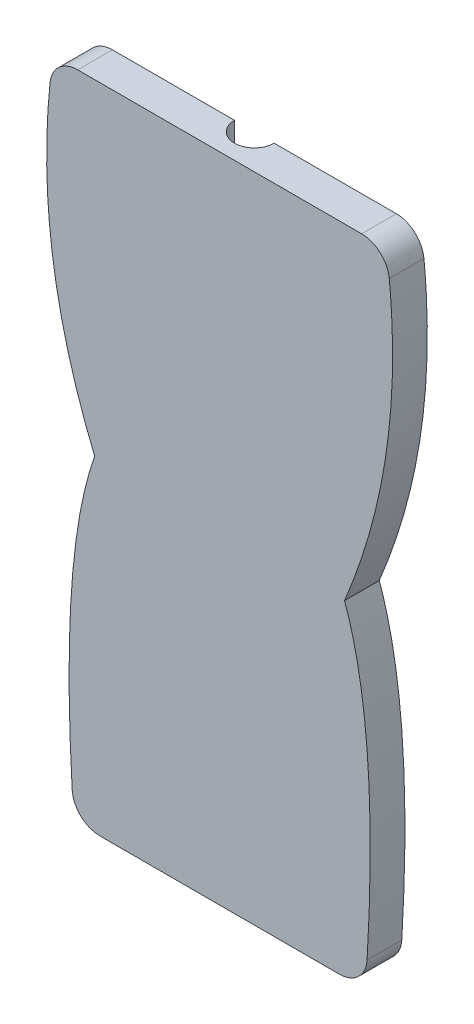
ISO-10303-21;
HEADER;
FILE_DESCRIPTION(('STEP AP214'),'2;1');
FILE_NAME('part.step','',(''),(''),'','','');
FILE_SCHEMA(('AUTOMOTIVE_DESIGN { 1 0 10303 214 1 1 1 1 }'));
ENDSEC;
DATA;
#1=APPLICATION_CONTEXT('core data for automotive mechanical design processes');
#2=APPLICATION_PROTOCOL_DEFINITION('international standard','automotive_design',2000,#1);
#3=PRODUCT_CONTEXT('',#1,'mechanical');
#4=PRODUCT('Part','Part','',(#3));
#5=PRODUCT_RELATED_PRODUCT_CATEGORY('part','',(#4));
#6=PRODUCT_DEFINITION_FORMATION('','',#4);
#7=PRODUCT_DEFINITION_CONTEXT('part definition',#1,'design');
#8=PRODUCT_DEFINITION('design','',#6,#7);
#9=PRODUCT_DEFINITION_SHAPE('','',#8);
#10=(LENGTH_UNIT() NAMED_UNIT(*) SI_UNIT(.MILLI.,.METRE.));
#11=(NAMED_UNIT(*) PLANE_ANGLE_UNIT() SI_UNIT($,.RADIAN.));
#12=(NAMED_UNIT(*) SI_UNIT($,.STERADIAN.) SOLID_ANGLE_UNIT());
#13=UNCERTAINTY_MEASURE_WITH_UNIT(LENGTH_MEASURE(1.E-05),#10,'distance_accuracy_value','');
#14=(GEOMETRIC_REPRESENTATION_CONTEXT(3) GLOBAL_UNCERTAINTY_ASSIGNED_CONTEXT((#13)) GLOBAL_UNIT_ASSIGNED_CONTEXT((#10,
#11,#12)) REPRESENTATION_CONTEXT('',''));
#15=CARTESIAN_POINT('',(0.,0.,0.));
#16=DIRECTION('',(0.,0.,1.));
#17=DIRECTION('',(1.,0.,0.));
#18=AXIS2_PLACEMENT_3D('',#15,#16,#17);
#19=CARTESIAN_POINT('',(86.2649284665313,20.,0.));
#20=DIRECTION('',(0.,0.,1.));
#21=DIRECTION('',(1.,0.,0.));
#22=AXIS2_PLACEMENT_3D('',#19,#20,#21);
#23=PLANE('',#22);
#24=DIRECTION('',(0.,-1.,0.));
#25=VECTOR('',#24,1.);
#26=CARTESIAN_POINT('',(-14.285,470.,0.));
#27=LINE('',#26,#25);
#28=CARTESIAN_POINT('',(-14.285,0.,0.));
#29=VERTEX_POINT('',#28);
#30=CARTESIAN_POINT('',(-14.285,470.,0.));
#31=VERTEX_POINT('',#30);
#32=EDGE_CURVE('E11',#29,#31,#27,.F.);
#33=ORIENTED_EDGE('',*,*,#32,.F.);
#34=DIRECTION('',(1.,0.,0.));
#35=VECTOR('',#34,1.);
#36=CARTESIAN_POINT('',(0.,0.,0.));
#37=LINE('',#36,#35);
#38=CARTESIAN_POINT('',(-86.2649284665312,0.,0.));
#39=VERTEX_POINT('',#38);
#40=EDGE_CURVE('E228',#39,#29,#37,.T.);
#41=ORIENTED_EDGE('',*,*,#40,.F.);
#42=CARTESIAN_POINT('',(-86.2649284665313,20.,0.));
#43=DIRECTION('',(0.,0.,1.));
#44=DIRECTION('',(1.,0.,0.));
#45=AXIS2_PLACEMENT_3D('',#42,#43,#44);
#46=CIRCLE('',#45,20.);
#47=CARTESIAN_POINT('',(-106.229930940437,18.8173435761193,0.));
#48=VERTEX_POINT('',#47);
#49=EDGE_CURVE('E105',#48,#39,#46,.T.);
#50=ORIENTED_EDGE('',*,*,#49,.F.);
#51=CARTESIAN_POINT('',(-90.,235.,0.));
#52=CARTESIAN_POINT('',(-98.3103938862567,211.902473228778,0.));
#53=CARTESIAN_POINT('',(-109.325776262568,152.774503719729,0.));
#54=CARTESIAN_POINT('',(-109.130347846538,67.7807022797824,0.));
#55=CARTESIAN_POINT('',(-106.229930940437,18.8173435761193,0.));
#56=B_SPLINE_CURVE_WITH_KNOTS('',3,(#51,#52,#53,#54,#55),.UNSPECIFIED.,.F.,.F.,(4,1,4),(0.,
0.470365123078241,0.940730246156483),.UNSPECIFIED.);
#57=CARTESIAN_POINT('',(-90.,235.,0.));
#58=VERTEX_POINT('',#57);
#59=EDGE_CURVE('E236',#58,#48,#56,.T.);
#60=ORIENTED_EDGE('',*,*,#59,.F.);
#61=CARTESIAN_POINT('',(-122.198947697111,452.052360091864,0.));
#62=CARTESIAN_POINT('',(-126.057079759915,414.653812214876,0.));
#63=CARTESIAN_POINT('',(-124.548720539871,341.079870989253,0.));
#64=CARTESIAN_POINT('',(-104.591114628509,269.952238820302,0.));
#65=CARTESIAN_POINT('',(-90.,235.,0.));
#66=B_SPLINE_CURVE_WITH_KNOTS('',3,(#61,#62,#63,#64,#65),.UNSPECIFIED.,.F.,.F.,(4,1,4),
(0.073881587658608,0.536940793829304,1.),.UNSPECIFIED.);
#67=CARTESIAN_POINT('',(-122.198947697111,452.052360091864,0.));
#68=VERTEX_POINT('',#67);
#69=EDGE_CURVE('E152',#68,#58,#66,.T.);
#70=ORIENTED_EDGE('',*,*,#69,.F.);
#71=CARTESIAN_POINT('',(-102.304530941314,450.,0.));
#72=DIRECTION('',(0.,0.,1.));
#73=DIRECTION('',(1.,0.,0.));
#74=AXIS2_PLACEMENT_3D('',#71,#72,#73);
#75=CIRCLE('',#74,20.0000000000001);
#76=CARTESIAN_POINT('',(-102.304530941314,470.,0.));
#77=VERTEX_POINT('',#76);
#78=EDGE_CURVE('E241',#77,#68,#75,.T.);
#79=ORIENTED_EDGE('',*,*,#78,.F.);
#80=DIRECTION('',(-1.,0.,0.));
#81=VECTOR('',#80,1.);
#82=CARTESIAN_POINT('',(0.,470.,0.));
#83=LINE('',#82,#81);
#84=EDGE_CURVE('E248',#31,#77,#83,.T.);
#85=ORIENTED_EDGE('',*,*,#84,.F.);
#86=EDGE_LOOP('',(#33,#41,#50,#60,#70,#79,#85));
#87=FACE_BOUND('',#86,.T.);
#88=ADVANCED_FACE('F40',(#87),#23,.F.);
#89=DIRECTION('',(0.,-1.,0.));
#90=VECTOR('',#89,1.);
#91=CARTESIAN_POINT('',(14.285,470.,0.));
#92=LINE('',#91,#90);
#93=CARTESIAN_POINT('',(14.285,470.,0.));
#94=VERTEX_POINT('',#93);
#95=CARTESIAN_POINT('',(14.285,0.,0.));
#96=VERTEX_POINT('',#95);
#97=EDGE_CURVE('E49',#94,#96,#92,.T.);
#98=ORIENTED_EDGE('',*,*,#97,.F.);
#99=CARTESIAN_POINT('',(102.304530941314,470.,0.));
#100=VERTEX_POINT('',#99);
#101=EDGE_CURVE('E244',#100,#94,#83,.T.);
#102=ORIENTED_EDGE('',*,*,#101,.F.);
#103=CARTESIAN_POINT('',(102.304530941314,450.,0.));
#104=DIRECTION('',(0.,0.,1.));
#105=DIRECTION('',(1.,0.,0.));
#106=AXIS2_PLACEMENT_3D('',#103,#104,#105);
#107=CIRCLE('',#106,20.);
#108=CARTESIAN_POINT('',(122.198947697111,452.052360091863,0.));
#109=VERTEX_POINT('',#108);
#110=EDGE_CURVE('E251',#109,#100,#107,.T.);
#111=ORIENTED_EDGE('',*,*,#110,.F.);
#112=CARTESIAN_POINT('',(90.,235.,0.));
#113=CARTESIAN_POINT('',(104.591114628509,269.952238820302,0.));
#114=CARTESIAN_POINT('',(124.548720539871,341.079870989253,0.));
#115=CARTESIAN_POINT('',(126.057079759915,414.653812214877,0.));
#116=CARTESIAN_POINT('',(122.198947697111,452.052360091864,0.));
#117=B_SPLINE_CURVE_WITH_KNOTS('',3,(#112,#113,#114,#115,#116),.UNSPECIFIED.,.F.,.F.,(4,1,4),
(0.0738815876586055,0.536940793829303,1.),.UNSPECIFIED.);
#118=CARTESIAN_POINT('',(90.,235.,0.));
#119=VERTEX_POINT('',#118);
#120=EDGE_CURVE('E254',#119,#109,#117,.T.);
#121=ORIENTED_EDGE('',*,*,#120,.F.);
#122=CARTESIAN_POINT('',(106.229930940437,18.8173435761193,0.));
#123=CARTESIAN_POINT('',(109.130347846538,67.7807022797824,0.));
#124=CARTESIAN_POINT('',(109.325776262568,152.774503719729,0.));
#125=CARTESIAN_POINT('',(98.3103938862567,211.902473228778,0.));
#126=CARTESIAN_POINT('',(90.,235.,0.));
#127=B_SPLINE_CURVE_WITH_KNOTS('',3,(#122,#123,#124,#125,#126),.UNSPECIFIED.,.F.,.F.,(4,1,4),
(0.,0.470365123078241,0.940730246156483),.UNSPECIFIED.);
#128=CARTESIAN_POINT('',(106.229930940437,18.8173435761193,0.));
#129=VERTEX_POINT('',#128);
#130=EDGE_CURVE('E257',#129,#119,#127,.T.);
#131=ORIENTED_EDGE('',*,*,#130,.F.);
#132=CARTESIAN_POINT('',(86.2649284665313,20.,0.));
#133=DIRECTION('',(0.,0.,1.));
#134=DIRECTION('',(1.,0.,0.));
#135=AXIS2_PLACEMENT_3D('',#132,#133,#134);
#136=CIRCLE('',#135,20.);
#137=CARTESIAN_POINT('',(86.2649284665312,0.,0.));
#138=VERTEX_POINT('',#137);
#139=EDGE_CURVE('E260',#138,#129,#136,.T.);
#140=ORIENTED_EDGE('',*,*,#139,.F.);
#141=EDGE_CURVE('E232',#96,#138,#37,.T.);
#142=ORIENTED_EDGE('',*,*,#141,.F.);
#143=EDGE_LOOP('',(#98,#102,#111,#121,#131,#140,#142));
#144=FACE_BOUND('',#143,.T.);
#145=ADVANCED_FACE('F278',(#144),#23,.F.);
#146=CARTESIAN_POINT('',(86.2649284665313,20.,25.));
#147=DIRECTION('',(0.,0.,-1.));
#148=DIRECTION('',(-1.,0.,0.));
#149=AXIS2_PLACEMENT_3D('',#146,#147,#148);
#150=CYLINDRICAL_SURFACE('',#149,20.);
#151=ORIENTED_EDGE('',*,*,#139,.T.);
#152=DIRECTION('',(0.,0.,-1.));
#153=VECTOR('',#152,1.);
#154=CARTESIAN_POINT('',(106.229930940437,18.8173435761193,25.));
#155=LINE('',#154,#153);
#156=CARTESIAN_POINT('',(106.229930940437,18.8173435761193,25.));
#157=VERTEX_POINT('',#156);
#158=EDGE_CURVE('E284',#157,#129,#155,.T.);
#159=ORIENTED_EDGE('',*,*,#158,.F.);
#160=CARTESIAN_POINT('',(86.2649284665313,20.,25.));
#161=DIRECTION('',(0.,0.,1.));
#162=DIRECTION('',(1.,0.,0.));
#163=AXIS2_PLACEMENT_3D('',#160,#161,#162);
#164=CIRCLE('',#163,20.);
#165=CARTESIAN_POINT('',(86.2649284665312,0.,25.));
#166=VERTEX_POINT('',#165);
#167=EDGE_CURVE('E113',#166,#157,#164,.T.);
#168=ORIENTED_EDGE('',*,*,#167,.F.);
#169=DIRECTION('',(0.,0.,-1.));
#170=VECTOR('',#169,1.);
#171=CARTESIAN_POINT('',(86.2649284665312,0.,25.));
#172=LINE('',#171,#170);
#173=EDGE_CURVE('E282',#166,#138,#172,.T.);
#174=ORIENTED_EDGE('',*,*,#173,.T.);
#175=EDGE_LOOP('',(#151,#159,#168,#174));
#176=FACE_BOUND('',#175,.T.);
#177=ADVANCED_FACE('F42',(#176),#150,.T.);
#178=CARTESIAN_POINT('',(106.229930940437,18.8173435761193,25.));
#179=CARTESIAN_POINT('',(109.130347846538,67.7807022797824,25.));
#180=CARTESIAN_POINT('',(109.325776262568,152.774503719729,25.));
#181=CARTESIAN_POINT('',(98.3103938862567,211.902473228778,25.));
#182=CARTESIAN_POINT('',(90.,235.,25.));
#183=B_SPLINE_CURVE_WITH_KNOTS('',3,(#178,#179,#180,#181,#182),.UNSPECIFIED.,.F.,.F.,(4,1,4),
(0.,0.470365123078241,0.940730246156483),.UNSPECIFIED.);
#184=DIRECTION('',(0.,0.,-1.));
#185=VECTOR('',#184,1.);
#186=SURFACE_OF_LINEAR_EXTRUSION('',#183,#185);
#187=ORIENTED_EDGE('',*,*,#130,.T.);
#188=DIRECTION('',(0.,0.,-1.));
#189=VECTOR('',#188,1.);
#190=CARTESIAN_POINT('',(90.,235.,25.));
#191=LINE('',#190,#189);
#192=CARTESIAN_POINT('',(90.,235.,25.));
#193=VERTEX_POINT('',#192);
#194=EDGE_CURVE('E288',#193,#119,#191,.T.);
#195=ORIENTED_EDGE('',*,*,#194,.F.);
#196=EDGE_CURVE('E211',#157,#193,#183,.T.);
#197=ORIENTED_EDGE('',*,*,#196,.F.);
#198=ORIENTED_EDGE('',*,*,#158,.T.);
#199=EDGE_LOOP('',(#187,#195,#197,#198));
#200=FACE_BOUND('',#199,.T.);
#201=ADVANCED_FACE('F201',(#200),#186,.F.);
#202=CARTESIAN_POINT('',(90.,235.,25.));
#203=CARTESIAN_POINT('',(104.591114628509,269.952238820302,25.));
#204=CARTESIAN_POINT('',(124.548720539871,341.079870989253,25.));
#205=CARTESIAN_POINT('',(126.057079759915,414.653812214877,25.));
#206=CARTESIAN_POINT('',(122.198947697111,452.052360091864,25.));
#207=B_SPLINE_CURVE_WITH_KNOTS('',3,(#202,#203,#204,#205,#206),.UNSPECIFIED.,.F.,.F.,(4,1,4),
(0.0738815876586055,0.536940793829303,1.),.UNSPECIFIED.);
#208=DIRECTION('',(0.,0.,-1.));
#209=VECTOR('',#208,1.);
#210=SURFACE_OF_LINEAR_EXTRUSION('',#207,#209);
#211=ORIENTED_EDGE('',*,*,#120,.T.);
#212=DIRECTION('',(0.,0.,-1.));
#213=VECTOR('',#212,1.);
#214=CARTESIAN_POINT('',(122.198947697111,452.052360091863,25.));
#215=LINE('',#214,#213);
#216=CARTESIAN_POINT('',(122.198947697111,452.052360091863,25.));
#217=VERTEX_POINT('',#216);
#218=EDGE_CURVE('E294',#217,#109,#215,.T.);
#219=ORIENTED_EDGE('',*,*,#218,.F.);
#220=EDGE_CURVE('E204',#193,#217,#207,.T.);
#221=ORIENTED_EDGE('',*,*,#220,.F.);
#222=ORIENTED_EDGE('',*,*,#194,.T.);
#223=EDGE_LOOP('',(#211,#219,#221,#222));
#224=FACE_BOUND('',#223,.T.);
#225=ADVANCED_FACE('F197',(#224),#210,.F.);
#226=CARTESIAN_POINT('',(102.304530941314,450.,25.));
#227=DIRECTION('',(0.,0.,-1.));
#228=DIRECTION('',(-1.,0.,0.));
#229=AXIS2_PLACEMENT_3D('',#226,#227,#228);
#230=CYLINDRICAL_SURFACE('',#229,20.);
#231=ORIENTED_EDGE('',*,*,#110,.T.);
#232=DIRECTION('',(0.,0.,-1.));
#233=VECTOR('',#232,1.);
#234=CARTESIAN_POINT('',(102.304530941314,470.,25.));
#235=LINE('',#234,#233);
#236=CARTESIAN_POINT('',(102.304530941314,470.,25.));
#237=VERTEX_POINT('',#236);
#238=EDGE_CURVE('E298',#237,#100,#235,.T.);
#239=ORIENTED_EDGE('',*,*,#238,.F.);
#240=CARTESIAN_POINT('',(102.304530941314,450.,25.));
#241=DIRECTION('',(0.,0.,1.));
#242=DIRECTION('',(1.,0.,0.));
#243=AXIS2_PLACEMENT_3D('',#240,#241,#242);
#244=CIRCLE('',#243,20.);
#245=EDGE_CURVE('E210',#217,#237,#244,.T.);
#246=ORIENTED_EDGE('',*,*,#245,.F.);
#247=ORIENTED_EDGE('',*,*,#218,.T.);
#248=EDGE_LOOP('',(#231,#239,#246,#247));
#249=FACE_BOUND('',#248,.T.);
#250=ADVANCED_FACE('F193',(#249),#230,.T.);
#251=CARTESIAN_POINT('',(0.,470.,25.));
#252=DIRECTION('',(0.,-1.,0.));
#253=DIRECTION('',(0.,0.,-1.));
#254=AXIS2_PLACEMENT_3D('',#251,#252,#253);
#255=PLANE('',#254);
#256=CARTESIAN_POINT('',(0.,470.,0.));
#257=DIRECTION('',(0.,1.,0.));
#258=DIRECTION('',(0.,0.,1.));
#259=AXIS2_PLACEMENT_3D('',#256,#257,#258);
#260=CIRCLE('',#259,14.285);
#261=EDGE_CURVE('E55',#31,#94,#260,.T.);
#262=ORIENTED_EDGE('',*,*,#261,.F.);
#263=ORIENTED_EDGE('',*,*,#84,.T.);
#264=DIRECTION('',(0.,0.,-1.));
#265=VECTOR('',#264,1.);
#266=CARTESIAN_POINT('',(-102.304530941314,470.,25.));
#267=LINE('',#266,#265);
#268=CARTESIAN_POINT('',(-102.304530941314,470.,25.));
#269=VERTEX_POINT('',#268);
#270=EDGE_CURVE('E302',#269,#77,#267,.T.);
#271=ORIENTED_EDGE('',*,*,#270,.F.);
#272=DIRECTION('',(-1.,0.,0.));
#273=VECTOR('',#272,1.);
#274=CARTESIAN_POINT('',(0.,470.,25.));
#275=LINE('',#274,#273);
#276=EDGE_CURVE('E221',#237,#269,#275,.T.);
#277=ORIENTED_EDGE('',*,*,#276,.F.);
#278=ORIENTED_EDGE('',*,*,#238,.T.);
#279=ORIENTED_EDGE('',*,*,#101,.T.);
#280=EDGE_LOOP('',(#262,#263,#271,#277,#278,#279));
#281=FACE_BOUND('',#280,.T.);
#282=ADVANCED_FACE('F189',(#281),#255,.F.);
#283=CARTESIAN_POINT('',(-102.304530941314,450.,25.));
#284=DIRECTION('',(0.,0.,-1.));
#285=DIRECTION('',(-1.,0.,0.));
#286=AXIS2_PLACEMENT_3D('',#283,#284,#285);
#287=CYLINDRICAL_SURFACE('',#286,20.0000000000001);
#288=ORIENTED_EDGE('',*,*,#78,.T.);
#289=DIRECTION('',(0.,0.,-1.));
#290=VECTOR('',#289,1.);
#291=CARTESIAN_POINT('',(-122.198947697111,452.052360091864,25.));
#292=LINE('',#291,#290);
#293=CARTESIAN_POINT('',(-122.198947697111,452.052360091864,25.));
#294=VERTEX_POINT('',#293);
#295=EDGE_CURVE('E156',#294,#68,#292,.T.);
#296=ORIENTED_EDGE('',*,*,#295,.F.);
#297=CARTESIAN_POINT('',(-102.304530941314,450.,25.));
#298=DIRECTION('',(0.,0.,1.));
#299=DIRECTION('',(1.,0.,0.));
#300=AXIS2_PLACEMENT_3D('',#297,#298,#299);
#301=CIRCLE('',#300,20.0000000000001);
#302=EDGE_CURVE('E142',#269,#294,#301,.T.);
#303=ORIENTED_EDGE('',*,*,#302,.F.);
#304=ORIENTED_EDGE('',*,*,#270,.T.);
#305=EDGE_LOOP('',(#288,#296,#303,#304));
#306=FACE_BOUND('',#305,.T.);
#307=ADVANCED_FACE('F186',(#306),#287,.T.);
#308=CARTESIAN_POINT('',(-122.198947697111,452.052360091864,25.));
#309=CARTESIAN_POINT('',(-126.057079759915,414.653812214876,25.));
#310=CARTESIAN_POINT('',(-124.548720539871,341.079870989253,25.));
#311=CARTESIAN_POINT('',(-104.591114628509,269.952238820302,25.));
#312=CARTESIAN_POINT('',(-90.,235.,25.));
#313=B_SPLINE_CURVE_WITH_KNOTS('',3,(#308,#309,#310,#311,#312),.UNSPECIFIED.,.F.,.F.,(4,1,4),
(0.073881587658608,0.536940793829304,1.),.UNSPECIFIED.);
#314=DIRECTION('',(0.,0.,-1.));
#315=VECTOR('',#314,1.);
#316=SURFACE_OF_LINEAR_EXTRUSION('',#313,#315);
#317=ORIENTED_EDGE('',*,*,#69,.T.);
#318=DIRECTION('',(0.,0.,-1.));
#319=VECTOR('',#318,1.);
#320=CARTESIAN_POINT('',(-90.,235.,25.));
#321=LINE('',#320,#319);
#322=CARTESIAN_POINT('',(-90.,235.,25.));
#323=VERTEX_POINT('',#322);
#324=EDGE_CURVE('E149',#323,#58,#321,.T.);
#325=ORIENTED_EDGE('',*,*,#324,.F.);
#326=EDGE_CURVE('E135',#294,#323,#313,.T.);
#327=ORIENTED_EDGE('',*,*,#326,.F.);
#328=ORIENTED_EDGE('',*,*,#295,.T.);
#329=EDGE_LOOP('',(#317,#325,#327,#328));
#330=FACE_BOUND('',#329,.T.);
#331=ADVANCED_FACE('F150',(#330),#316,.F.);
#332=CARTESIAN_POINT('',(-90.,235.,25.));
#333=CARTESIAN_POINT('',(-98.3103938862567,211.902473228778,25.));
#334=CARTESIAN_POINT('',(-109.325776262568,152.774503719729,25.));
#335=CARTESIAN_POINT('',(-109.130347846538,67.7807022797824,25.));
#336=CARTESIAN_POINT('',(-106.229930940437,18.8173435761193,25.));
#337=B_SPLINE_CURVE_WITH_KNOTS('',3,(#332,#333,#334,#335,#336),.UNSPECIFIED.,.F.,.F.,(4,1,4),
(0.,0.470365123078241,0.940730246156483),.UNSPECIFIED.);
#338=DIRECTION('',(0.,0.,-1.));
#339=VECTOR('',#338,1.);
#340=SURFACE_OF_LINEAR_EXTRUSION('',#337,#339);
#341=ORIENTED_EDGE('',*,*,#59,.T.);
#342=DIRECTION('',(0.,0.,-1.));
#343=VECTOR('',#342,1.);
#344=CARTESIAN_POINT('',(-106.229930940437,18.8173435761193,25.));
#345=LINE('',#344,#343);
#346=CARTESIAN_POINT('',(-106.229930940437,18.8173435761193,25.));
#347=VERTEX_POINT('',#346);
#348=EDGE_CURVE('E157',#347,#48,#345,.T.);
#349=ORIENTED_EDGE('',*,*,#348,.F.);
#350=EDGE_CURVE('E139',#323,#347,#337,.T.);
#351=ORIENTED_EDGE('',*,*,#350,.F.);
#352=ORIENTED_EDGE('',*,*,#324,.T.);
#353=EDGE_LOOP('',(#341,#349,#351,#352));
#354=FACE_BOUND('',#353,.T.);
#355=ADVANCED_FACE('F159',(#354),#340,.F.);
#356=CARTESIAN_POINT('',(-86.2649284665313,20.,25.));
#357=DIRECTION('',(0.,0.,-1.));
#358=DIRECTION('',(-1.,0.,0.));
#359=AXIS2_PLACEMENT_3D('',#356,#357,#358);
#360=CYLINDRICAL_SURFACE('',#359,20.);
#361=ORIENTED_EDGE('',*,*,#49,.T.);
#362=DIRECTION('',(0.,0.,-1.));
#363=VECTOR('',#362,1.);
#364=CARTESIAN_POINT('',(-86.2649284665312,0.,25.));
#365=LINE('',#364,#363);
#366=CARTESIAN_POINT('',(-86.2649284665312,0.,25.));
#367=VERTEX_POINT('',#366);
#368=EDGE_CURVE('E165',#367,#39,#365,.T.);
#369=ORIENTED_EDGE('',*,*,#368,.F.);
#370=CARTESIAN_POINT('',(-86.2649284665313,20.,25.));
#371=DIRECTION('',(0.,0.,1.));
#372=DIRECTION('',(1.,0.,0.));
#373=AXIS2_PLACEMENT_3D('',#370,#371,#372);
#374=CIRCLE('',#373,20.);
#375=EDGE_CURVE('E162',#347,#367,#374,.T.);
#376=ORIENTED_EDGE('',*,*,#375,.F.);
#377=ORIENTED_EDGE('',*,*,#348,.T.);
#378=EDGE_LOOP('',(#361,#369,#376,#377));
#379=FACE_BOUND('',#378,.T.);
#380=ADVANCED_FACE('F182',(#379),#360,.T.);
#381=CARTESIAN_POINT('',(0.,0.,25.));
#382=DIRECTION('',(0.,1.,0.));
#383=DIRECTION('',(-1.,0.,0.));
#384=AXIS2_PLACEMENT_3D('',#381,#382,#383);
#385=PLANE('',#384);
#386=CARTESIAN_POINT('',(0.,0.,0.));
#387=DIRECTION('',(0.,1.,0.));
#388=DIRECTION('',(0.,0.,1.));
#389=AXIS2_PLACEMENT_3D('',#386,#387,#388);
#390=CIRCLE('',#389,14.285);
#391=EDGE_CURVE('E264',#29,#96,#390,.T.);
#392=ORIENTED_EDGE('',*,*,#391,.T.);
#393=ORIENTED_EDGE('',*,*,#141,.T.);
#394=ORIENTED_EDGE('',*,*,#173,.F.);
#395=DIRECTION('',(1.,0.,0.));
#396=VECTOR('',#395,1.);
#397=CARTESIAN_POINT('',(0.,0.,25.));
#398=LINE('',#397,#396);
#399=EDGE_CURVE('E64',#367,#166,#398,.T.);
#400=ORIENTED_EDGE('',*,*,#399,.F.);
#401=ORIENTED_EDGE('',*,*,#368,.T.);
#402=ORIENTED_EDGE('',*,*,#40,.T.);
#403=EDGE_LOOP('',(#392,#393,#394,#400,#401,#402));
#404=FACE_BOUND('',#403,.T.);
#405=ADVANCED_FACE('F271',(#404),#385,.F.);
#406=CARTESIAN_POINT('',(86.2649284665313,20.,25.));
#407=DIRECTION('',(0.,0.,1.));
#408=DIRECTION('',(1.,0.,0.));
#409=AXIS2_PLACEMENT_3D('',#406,#407,#408);
#410=PLANE('',#409);
#411=ORIENTED_EDGE('',*,*,#399,.T.);
#412=ORIENTED_EDGE('',*,*,#167,.T.);
#413=ORIENTED_EDGE('',*,*,#196,.T.);
#414=ORIENTED_EDGE('',*,*,#220,.T.);
#415=ORIENTED_EDGE('',*,*,#245,.T.);
#416=ORIENTED_EDGE('',*,*,#276,.T.);
#417=ORIENTED_EDGE('',*,*,#302,.T.);
#418=ORIENTED_EDGE('',*,*,#326,.T.);
#419=ORIENTED_EDGE('',*,*,#350,.T.);
#420=ORIENTED_EDGE('',*,*,#375,.T.);
#421=EDGE_LOOP('',(#411,#412,#413,#414,#415,#416,#417,#418,#419,#420));
#422=FACE_BOUND('',#421,.T.);
#423=ADVANCED_FACE('F137',(#422),#410,.T.);
#424=CARTESIAN_POINT('',(0.,470.,0.));
#425=DIRECTION('',(0.,-1.,0.));
#426=DIRECTION('',(0.,0.,-1.));
#427=AXIS2_PLACEMENT_3D('',#424,#425,#426);
#428=CYLINDRICAL_SURFACE('',#427,14.285);
#429=ORIENTED_EDGE('',*,*,#32,.T.);
#430=ORIENTED_EDGE('',*,*,#261,.T.);
#431=ORIENTED_EDGE('',*,*,#97,.T.);
#432=ORIENTED_EDGE('',*,*,#391,.F.);
#433=EDGE_LOOP('',(#429,#430,#431,#432));
#434=FACE_BOUND('',#433,.T.);
#435=ADVANCED_FACE('F334',(#434),#428,.F.);
#436=CLOSED_SHELL('',(#88,#145,#177,#201,#225,#250,#282,#307,#331,#355,#380,#405,#423,#435));
#437=MANIFOLD_SOLID_BREP('B2',#436);
#438=ADVANCED_BREP_SHAPE_REPRESENTATION('',(#18,#437),#14);
#439=SHAPE_DEFINITION_REPRESENTATION(#9,#438);
ENDSEC;
END-ISO-10303-21;
